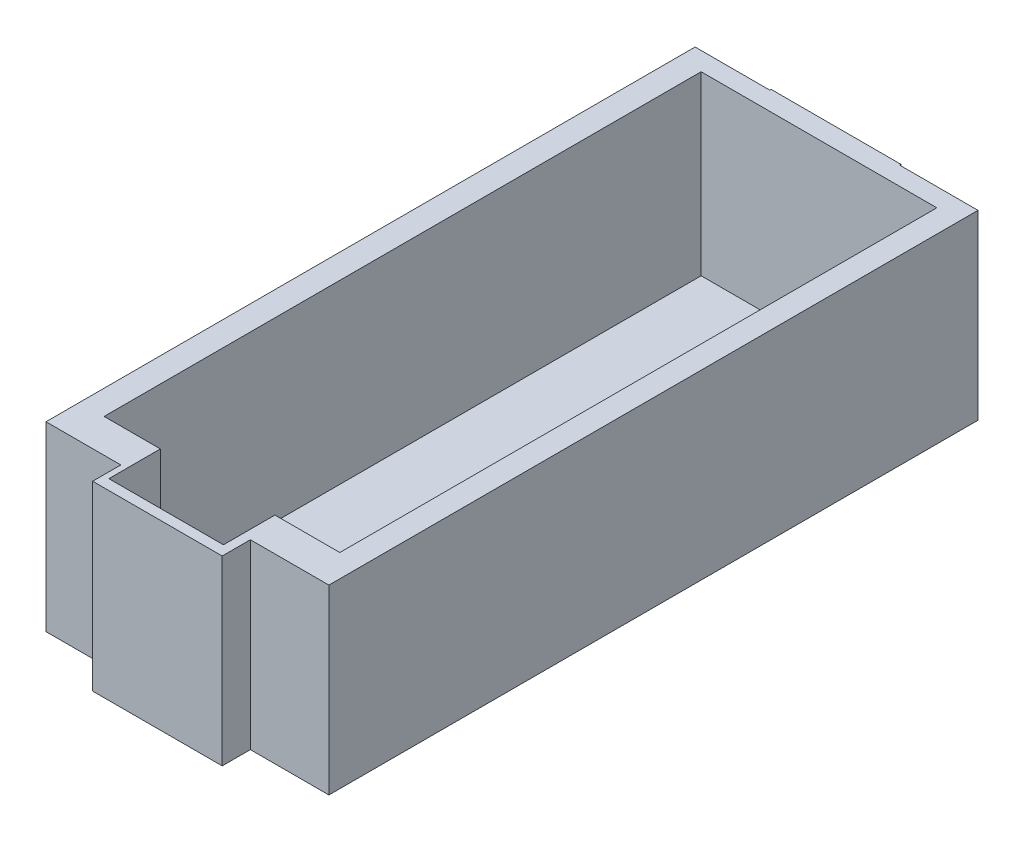
ISO-10303-21;
HEADER;
FILE_DESCRIPTION(('STEP AP214'),'2;1');
FILE_NAME('part.step','',(''),(''),'','','');
FILE_SCHEMA(('AUTOMOTIVE_DESIGN { 1 0 10303 214 1 1 1 1 }'));
ENDSEC;
DATA;
#1=APPLICATION_CONTEXT('core data for automotive mechanical design processes');
#2=APPLICATION_PROTOCOL_DEFINITION('international standard','automotive_design',2000,#1);
#3=PRODUCT_CONTEXT('',#1,'mechanical');
#4=PRODUCT('Part','Part','',(#3));
#5=PRODUCT_RELATED_PRODUCT_CATEGORY('part','',(#4));
#6=PRODUCT_DEFINITION_FORMATION('','',#4);
#7=PRODUCT_DEFINITION_CONTEXT('part definition',#1,'design');
#8=PRODUCT_DEFINITION('design','',#6,#7);
#9=PRODUCT_DEFINITION_SHAPE('','',#8);
#10=(LENGTH_UNIT() NAMED_UNIT(*) SI_UNIT(.MILLI.,.METRE.));
#11=(NAMED_UNIT(*) PLANE_ANGLE_UNIT() SI_UNIT($,.RADIAN.));
#12=(NAMED_UNIT(*) SI_UNIT($,.STERADIAN.) SOLID_ANGLE_UNIT());
#13=UNCERTAINTY_MEASURE_WITH_UNIT(LENGTH_MEASURE(1.E-05),#10,'distance_accuracy_value','');
#14=(GEOMETRIC_REPRESENTATION_CONTEXT(3) GLOBAL_UNCERTAINTY_ASSIGNED_CONTEXT((#13)) GLOBAL_UNIT_ASSIGNED_CONTEXT((#10,
#11,#12)) REPRESENTATION_CONTEXT('',''));
#15=CARTESIAN_POINT('',(0.,0.,0.));
#16=DIRECTION('',(0.,0.,1.));
#17=DIRECTION('',(1.,0.,0.));
#18=AXIS2_PLACEMENT_3D('',#15,#16,#17);
#19=CARTESIAN_POINT('',(-3.05042115850514,12.7577281754318,26.5483315053835));
#20=DIRECTION('',(0.,0.,1.));
#21=DIRECTION('',(1.,0.,0.));
#22=AXIS2_PLACEMENT_3D('',#19,#20,#21);
#23=PLANE('',#22);
#24=DIRECTION('',(1.,0.,0.));
#25=VECTOR('',#24,1.);
#26=CARTESIAN_POINT('',(-3.05042115850514,12.7577281754318,26.5483315053835));
#27=LINE('',#26,#25);
#28=CARTESIAN_POINT('',(4.3035209180502,12.7577281754318,26.5483315053835));
#29=VERTEX_POINT('',#28);
#30=CARTESIAN_POINT('',(7.09590471597179,12.7577281754318,26.5483315053835));
#31=VERTEX_POINT('',#30);
#32=EDGE_CURVE('E234',#29,#31,#27,.T.);
#33=ORIENTED_EDGE('',*,*,#32,.F.);
#34=DIRECTION('',(0.,1.,0.));
#35=VECTOR('',#34,1.);
#36=CARTESIAN_POINT('',(4.3035209180502,12.7577281754318,26.5483315053835));
#37=LINE('',#36,#35);
#38=CARTESIAN_POINT('',(4.3035209180502,20.3640540499087,26.5483315053835));
#39=VERTEX_POINT('',#38);
#40=EDGE_CURVE('E225',#29,#39,#37,.T.);
#41=ORIENTED_EDGE('',*,*,#40,.T.);
#42=DIRECTION('',(1.,0.,0.));
#43=VECTOR('',#42,1.);
#44=CARTESIAN_POINT('',(-3.05042115850514,20.3640540499087,26.5483315053835));
#45=LINE('',#44,#43);
#46=CARTESIAN_POINT('',(7.09590471597179,20.3640540499087,26.5483315053835));
#47=VERTEX_POINT('',#46);
#48=EDGE_CURVE('E249',#39,#47,#45,.T.);
#49=ORIENTED_EDGE('',*,*,#48,.T.);
#50=DIRECTION('',(0.,1.,0.));
#51=VECTOR('',#50,1.);
#52=CARTESIAN_POINT('',(7.09590471597179,12.7577281754318,26.5483315053835));
#53=LINE('',#52,#51);
#54=EDGE_CURVE('E252',#31,#47,#53,.T.);
#55=ORIENTED_EDGE('',*,*,#54,.F.);
#56=EDGE_LOOP('',(#33,#41,#49,#55));
#57=FACE_BOUND('',#56,.T.);
#58=ADVANCED_FACE('F67',(#57),#23,.F.);
#59=CARTESIAN_POINT('',(0.,0.,27.9972287789867));
#60=DIRECTION('',(0.,0.,1.));
#61=DIRECTION('',(1.,0.,0.));
#62=AXIS2_PLACEMENT_3D('',#59,#60,#61);
#63=PLANE('',#62);
#64=DIRECTION('',(-1.,0.,0.));
#65=VECTOR('',#64,1.);
#66=CARTESIAN_POINT('',(-4.10273901714046,12.5386522366116,27.9972287789867));
#67=LINE('',#66,#65);
#68=CARTESIAN_POINT('',(-0.882360232896556,12.5386522366116,27.9972287789867));
#69=VERTEX_POINT('',#68);
#70=CARTESIAN_POINT('',(-4.10273901714046,12.5386522366116,27.9972287789867));
#71=VERTEX_POINT('',#70);
#72=EDGE_CURVE('E307',#69,#71,#67,.T.);
#73=ORIENTED_EDGE('',*,*,#72,.F.);
#74=DIRECTION('',(0.,1.,0.));
#75=VECTOR('',#74,1.);
#76=CARTESIAN_POINT('',(-0.882360232896555,0.,27.9972287789867));
#77=LINE('',#76,#75);
#78=CARTESIAN_POINT('',(-0.882360232896557,20.3640540499087,27.9972287789867));
#79=VERTEX_POINT('',#78);
#80=EDGE_CURVE('E300',#69,#79,#77,.T.);
#81=ORIENTED_EDGE('',*,*,#80,.T.);
#82=DIRECTION('',(1.,0.,0.));
#83=VECTOR('',#82,1.);
#84=CARTESIAN_POINT('',(-4.10273901714046,20.3640540499087,27.9972287789867));
#85=LINE('',#84,#83);
#86=CARTESIAN_POINT('',(-4.10273901714046,20.3640540499087,27.9972287789867));
#87=VERTEX_POINT('',#86);
#88=EDGE_CURVE('E323',#87,#79,#85,.T.);
#89=ORIENTED_EDGE('',*,*,#88,.F.);
#90=DIRECTION('',(0.,1.,0.));
#91=VECTOR('',#90,1.);
#92=CARTESIAN_POINT('',(-4.10273901714046,20.3640540499087,27.9972287789867));
#93=LINE('',#92,#91);
#94=EDGE_CURVE('E303',#71,#87,#93,.T.);
#95=ORIENTED_EDGE('',*,*,#94,.F.);
#96=EDGE_LOOP('',(#73,#81,#89,#95));
#97=FACE_BOUND('',#96,.T.);
#98=ADVANCED_FACE('F69',(#97),#63,.T.);
#99=CARTESIAN_POINT('',(4.69406728467612,20.3640540499087,27.9972287789867));
#100=VERTEX_POINT('',#99);
#101=CARTESIAN_POINT('',(8.07522060652442,20.3640540499087,27.9972287789867));
#102=VERTEX_POINT('',#101);
#103=EDGE_CURVE('E324',#100,#102,#85,.T.);
#104=ORIENTED_EDGE('',*,*,#103,.F.);
#105=DIRECTION('',(0.,-1.,0.));
#106=VECTOR('',#105,1.);
#107=CARTESIAN_POINT('',(4.69406728467613,0.,27.9972287789867));
#108=LINE('',#107,#106);
#109=CARTESIAN_POINT('',(4.69406728467612,12.5386522366116,27.9972287789867));
#110=VERTEX_POINT('',#109);
#111=EDGE_CURVE('E294',#100,#110,#108,.T.);
#112=ORIENTED_EDGE('',*,*,#111,.T.);
#113=CARTESIAN_POINT('',(8.07522060652442,12.5386522366116,27.9972287789867));
#114=VERTEX_POINT('',#113);
#115=EDGE_CURVE('E328',#114,#110,#67,.T.);
#116=ORIENTED_EDGE('',*,*,#115,.F.);
#117=DIRECTION('',(0.,-1.,0.));
#118=VECTOR('',#117,1.);
#119=CARTESIAN_POINT('',(8.07522060652442,20.3640540499087,27.9972287789867));
#120=LINE('',#119,#118);
#121=EDGE_CURVE('E350',#102,#114,#120,.T.);
#122=ORIENTED_EDGE('',*,*,#121,.F.);
#123=EDGE_LOOP('',(#104,#112,#116,#122));
#124=FACE_BOUND('',#123,.T.);
#125=ADVANCED_FACE('F409',(#124),#63,.T.);
#126=CARTESIAN_POINT('',(0.,0.,0.0572287789866853));
#127=DIRECTION('',(0.,0.,1.));
#128=DIRECTION('',(1.,0.,0.));
#129=AXIS2_PLACEMENT_3D('',#126,#127,#128);
#130=PLANE('',#129);
#131=DIRECTION('',(0.,1.,0.));
#132=VECTOR('',#131,1.);
#133=CARTESIAN_POINT('',(-0.882360232896555,0.,0.0572287789866853));
#134=LINE('',#133,#132);
#135=CARTESIAN_POINT('',(-0.882360232896556,12.5386522366116,0.0572287789866846));
#136=VERTEX_POINT('',#135);
#137=CARTESIAN_POINT('',(-0.882360232896557,20.3640540499087,0.0572287789866846));
#138=VERTEX_POINT('',#137);
#139=EDGE_CURVE('E297',#136,#138,#134,.T.);
#140=ORIENTED_EDGE('',*,*,#139,.F.);
#141=DIRECTION('',(-1.,0.,0.));
#142=VECTOR('',#141,1.);
#143=CARTESIAN_POINT('',(-4.10273901714046,12.5386522366116,0.0572287789866846));
#144=LINE('',#143,#142);
#145=CARTESIAN_POINT('',(-4.10273901714046,12.5386522366116,0.0572287789866846));
#146=VERTEX_POINT('',#145);
#147=EDGE_CURVE('E71',#136,#146,#144,.T.);
#148=ORIENTED_EDGE('',*,*,#147,.T.);
#149=DIRECTION('',(0.,1.,0.));
#150=VECTOR('',#149,1.);
#151=CARTESIAN_POINT('',(-4.10273901714046,20.3640540499087,0.0572287789866846));
#152=LINE('',#151,#150);
#153=CARTESIAN_POINT('',(-4.10273901714046,20.3640540499087,0.0572287789866846));
#154=VERTEX_POINT('',#153);
#155=EDGE_CURVE('E308',#146,#154,#152,.T.);
#156=ORIENTED_EDGE('',*,*,#155,.T.);
#157=DIRECTION('',(1.,0.,0.));
#158=VECTOR('',#157,1.);
#159=CARTESIAN_POINT('',(-4.10273901714046,20.3640540499087,0.0572287789866846));
#160=LINE('',#159,#158);
#161=EDGE_CURVE('E12',#154,#138,#160,.T.);
#162=ORIENTED_EDGE('',*,*,#161,.T.);
#163=EDGE_LOOP('',(#140,#148,#156,#162));
#164=FACE_BOUND('',#163,.T.);
#165=ADVANCED_FACE('F368',(#164),#130,.F.);
#166=DIRECTION('',(0.,-1.,0.));
#167=VECTOR('',#166,1.);
#168=CARTESIAN_POINT('',(4.69406728467613,0.,0.0572287789866853));
#169=LINE('',#168,#167);
#170=CARTESIAN_POINT('',(4.69406728467612,20.3640540499087,0.0572287789866906));
#171=VERTEX_POINT('',#170);
#172=CARTESIAN_POINT('',(4.69406728467612,12.5386522366116,0.0572287789866846));
#173=VERTEX_POINT('',#172);
#174=EDGE_CURVE('E291',#171,#173,#169,.T.);
#175=ORIENTED_EDGE('',*,*,#174,.F.);
#176=CARTESIAN_POINT('',(8.07522060652442,20.3640540499087,0.0572287789866846));
#177=VERTEX_POINT('',#176);
#178=EDGE_CURVE('E77',#171,#177,#160,.T.);
#179=ORIENTED_EDGE('',*,*,#178,.T.);
#180=DIRECTION('',(0.,-1.,0.));
#181=VECTOR('',#180,1.);
#182=CARTESIAN_POINT('',(8.07522060652442,20.3640540499087,0.0572287789866846));
#183=LINE('',#182,#181);
#184=CARTESIAN_POINT('',(8.07522060652442,12.5386522366116,0.0572287789866846));
#185=VERTEX_POINT('',#184);
#186=EDGE_CURVE('E402',#177,#185,#183,.T.);
#187=ORIENTED_EDGE('',*,*,#186,.T.);
#188=EDGE_CURVE('E353',#185,#173,#144,.T.);
#189=ORIENTED_EDGE('',*,*,#188,.T.);
#190=EDGE_LOOP('',(#175,#179,#187,#189));
#191=FACE_BOUND('',#190,.T.);
#192=ADVANCED_FACE('F405',(#191),#130,.F.);
#193=CARTESIAN_POINT('',(-4.10273901714046,20.3640540499087,0.0572287789866846));
#194=DIRECTION('',(1.,0.,0.));
#195=DIRECTION('',(0.,0.,-1.));
#196=AXIS2_PLACEMENT_3D('',#193,#194,#195);
#197=PLANE('',#196);
#198=ORIENTED_EDGE('',*,*,#94,.T.);
#199=DIRECTION('',(0.,0.,1.));
#200=VECTOR('',#199,1.);
#201=CARTESIAN_POINT('',(-4.10273901714046,20.3640540499087,0.0572287789866846));
#202=LINE('',#201,#200);
#203=EDGE_CURVE('E304',#154,#87,#202,.T.);
#204=ORIENTED_EDGE('',*,*,#203,.F.);
#205=ORIENTED_EDGE('',*,*,#155,.F.);
#206=DIRECTION('',(0.,0.,1.));
#207=VECTOR('',#206,1.);
#208=CARTESIAN_POINT('',(-4.10273901714046,12.5386522366116,0.0572287789866846));
#209=LINE('',#208,#207);
#210=EDGE_CURVE('E313',#146,#71,#209,.T.);
#211=ORIENTED_EDGE('',*,*,#210,.T.);
#212=EDGE_LOOP('',(#198,#204,#205,#211));
#213=FACE_BOUND('',#212,.T.);
#214=ADVANCED_FACE('F371',(#213),#197,.F.);
#215=CARTESIAN_POINT('',(-4.10273901714046,12.5386522366116,0.0572287789866846));
#216=DIRECTION('',(0.,1.,0.));
#217=DIRECTION('',(0.,0.,1.));
#218=AXIS2_PLACEMENT_3D('',#215,#216,#217);
#219=PLANE('',#218);
#220=ORIENTED_EDGE('',*,*,#115,.T.);
#221=DIRECTION('',(0.,0.,-1.));
#222=VECTOR('',#221,1.);
#223=CARTESIAN_POINT('',(4.69406728467612,12.5386522366116,29.21));
#224=LINE('',#223,#222);
#225=CARTESIAN_POINT('',(4.69406728467612,12.5386522366116,29.21));
#226=VERTEX_POINT('',#225);
#227=EDGE_CURVE('E285',#226,#110,#224,.T.);
#228=ORIENTED_EDGE('',*,*,#227,.F.);
#229=DIRECTION('',(1.,0.,0.));
#230=VECTOR('',#229,1.);
#231=CARTESIAN_POINT('',(-0.882360232896556,12.5386522366116,29.21));
#232=LINE('',#231,#230);
#233=CARTESIAN_POINT('',(-0.882360232896556,12.5386522366116,29.21));
#234=VERTEX_POINT('',#233);
#235=EDGE_CURVE('E261',#234,#226,#232,.T.);
#236=ORIENTED_EDGE('',*,*,#235,.F.);
#237=DIRECTION('',(0.,0.,-1.));
#238=VECTOR('',#237,1.);
#239=CARTESIAN_POINT('',(-0.882360232896556,12.5386522366116,29.21));
#240=LINE('',#239,#238);
#241=EDGE_CURVE('E288',#234,#69,#240,.T.);
#242=ORIENTED_EDGE('',*,*,#241,.T.);
#243=ORIENTED_EDGE('',*,*,#72,.T.);
#244=ORIENTED_EDGE('',*,*,#210,.F.);
#245=ORIENTED_EDGE('',*,*,#147,.F.);
#246=CARTESIAN_POINT('',(-0.882360232896556,12.5386522366116,0.));
#247=VERTEX_POINT('',#246);
#248=EDGE_CURVE('E287',#136,#247,#240,.T.);
#249=ORIENTED_EDGE('',*,*,#248,.T.);
#250=DIRECTION('',(1.,0.,0.));
#251=VECTOR('',#250,1.);
#252=CARTESIAN_POINT('',(-0.882360232896556,12.5386522366116,0.));
#253=LINE('',#252,#251);
#254=CARTESIAN_POINT('',(4.69406728467612,12.5386522366116,0.));
#255=VERTEX_POINT('',#254);
#256=EDGE_CURVE('E271',#247,#255,#253,.T.);
#257=ORIENTED_EDGE('',*,*,#256,.T.);
#258=EDGE_CURVE('E284',#173,#255,#224,.T.);
#259=ORIENTED_EDGE('',*,*,#258,.F.);
#260=ORIENTED_EDGE('',*,*,#188,.F.);
#261=DIRECTION('',(0.,0.,1.));
#262=VECTOR('',#261,1.);
#263=CARTESIAN_POINT('',(8.07522060652442,12.5386522366116,0.0572287789866846));
#264=LINE('',#263,#262);
#265=EDGE_CURVE('E356',#185,#114,#264,.T.);
#266=ORIENTED_EDGE('',*,*,#265,.T.);
#267=EDGE_LOOP('',(#220,#228,#236,#242,#243,#244,#245,#249,#257,#259,#260,#266));
#268=FACE_BOUND('',#267,.T.);
#269=ADVANCED_FACE('F373',(#268),#219,.F.);
#270=CARTESIAN_POINT('',(8.07522060652442,20.3640540499087,0.0572287789866846));
#271=DIRECTION('',(-1.,0.,0.));
#272=DIRECTION('',(0.,0.,1.));
#273=AXIS2_PLACEMENT_3D('',#270,#271,#272);
#274=PLANE('',#273);
#275=ORIENTED_EDGE('',*,*,#121,.T.);
#276=ORIENTED_EDGE('',*,*,#265,.F.);
#277=ORIENTED_EDGE('',*,*,#186,.F.);
#278=DIRECTION('',(0.,0.,1.));
#279=VECTOR('',#278,1.);
#280=CARTESIAN_POINT('',(8.07522060652442,20.3640540499087,0.0572287789866846));
#281=LINE('',#280,#279);
#282=EDGE_CURVE('E318',#177,#102,#281,.T.);
#283=ORIENTED_EDGE('',*,*,#282,.T.);
#284=EDGE_LOOP('',(#275,#276,#277,#283));
#285=FACE_BOUND('',#284,.T.);
#286=ADVANCED_FACE('F400',(#285),#274,.F.);
#287=CARTESIAN_POINT('',(-4.10273901714046,20.3640540499087,0.0572287789866846));
#288=DIRECTION('',(0.,-1.,0.));
#289=DIRECTION('',(0.,0.,-1.));
#290=AXIS2_PLACEMENT_3D('',#287,#288,#289);
#291=PLANE('',#290);
#292=ORIENTED_EDGE('',*,*,#48,.F.);
#293=DIRECTION('',(0.,0.,-1.));
#294=VECTOR('',#293,1.);
#295=CARTESIAN_POINT('',(4.3035209180502,20.3640540499087,28.7652129392163));
#296=LINE('',#295,#294);
#297=CARTESIAN_POINT('',(4.3035209180502,20.3640540499087,28.7652129392163));
#298=VERTEX_POINT('',#297);
#299=EDGE_CURVE('E609',#298,#39,#296,.T.);
#300=ORIENTED_EDGE('',*,*,#299,.F.);
#301=DIRECTION('',(1.,0.,0.));
#302=VECTOR('',#301,1.);
#303=CARTESIAN_POINT('',(-0.628393960971162,20.3640540499087,28.7652129392163));
#304=LINE('',#303,#302);
#305=CARTESIAN_POINT('',(-0.628393960971162,20.3640540499087,28.7652129392163));
#306=VERTEX_POINT('',#305);
#307=EDGE_CURVE('E604',#306,#298,#304,.T.);
#308=ORIENTED_EDGE('',*,*,#307,.F.);
#309=DIRECTION('',(0.,0.,1.));
#310=VECTOR('',#309,1.);
#311=CARTESIAN_POINT('',(-0.628393960971162,20.3640540499087,28.7652129392163));
#312=LINE('',#311,#310);
#313=CARTESIAN_POINT('',(-0.628393960971162,20.3640540499087,26.5483315053835));
#314=VERTEX_POINT('',#313);
#315=EDGE_CURVE('E606',#314,#306,#312,.T.);
#316=ORIENTED_EDGE('',*,*,#315,.F.);
#317=CARTESIAN_POINT('',(-3.05042115850514,20.3640540499087,26.5483315053835));
#318=VERTEX_POINT('',#317);
#319=EDGE_CURVE('E224',#318,#314,#45,.T.);
#320=ORIENTED_EDGE('',*,*,#319,.F.);
#321=DIRECTION('',(0.,0.,1.));
#322=VECTOR('',#321,1.);
#323=CARTESIAN_POINT('',(-3.05042115850514,20.3640540499087,26.5483315053835));
#324=LINE('',#323,#322);
#325=CARTESIAN_POINT('',(-3.05042115850514,20.3640540499087,0.849243341562434));
#326=VERTEX_POINT('',#325);
#327=EDGE_CURVE('E246',#326,#318,#324,.T.);
#328=ORIENTED_EDGE('',*,*,#327,.F.);
#329=DIRECTION('',(-1.,0.,0.));
#330=VECTOR('',#329,1.);
#331=CARTESIAN_POINT('',(-3.05042115850514,20.3640540499087,0.849243341562434));
#332=LINE('',#331,#330);
#333=CARTESIAN_POINT('',(7.09590471597179,20.3640540499087,0.849243341562434));
#334=VERTEX_POINT('',#333);
#335=EDGE_CURVE('E242',#334,#326,#332,.T.);
#336=ORIENTED_EDGE('',*,*,#335,.F.);
#337=DIRECTION('',(0.,0.,-1.));
#338=VECTOR('',#337,1.);
#339=CARTESIAN_POINT('',(7.09590471597179,20.3640540499087,26.5483315053835));
#340=LINE('',#339,#338);
#341=EDGE_CURVE('E93',#47,#334,#340,.T.);
#342=ORIENTED_EDGE('',*,*,#341,.F.);
#343=EDGE_LOOP('',(#292,#300,#308,#316,#320,#328,#336,#342));
#344=FACE_BOUND('',#343,.T.);
#345=ORIENTED_EDGE('',*,*,#178,.F.);
#346=DIRECTION('',(0.,0.,-1.));
#347=VECTOR('',#346,1.);
#348=CARTESIAN_POINT('',(4.69406728467612,20.3640540499087,29.21));
#349=LINE('',#348,#347);
#350=CARTESIAN_POINT('',(4.69406728467612,20.3640540499087,0.));
#351=VERTEX_POINT('',#350);
#352=EDGE_CURVE('E281',#171,#351,#349,.T.);
#353=ORIENTED_EDGE('',*,*,#352,.T.);
#354=DIRECTION('',(-1.,0.,0.));
#355=VECTOR('',#354,1.);
#356=CARTESIAN_POINT('',(-0.882360232896557,20.3640540499087,0.));
#357=LINE('',#356,#355);
#358=CARTESIAN_POINT('',(-0.882360232896557,20.3640540499087,0.));
#359=VERTEX_POINT('',#358);
#360=EDGE_CURVE('E262',#351,#359,#357,.T.);
#361=ORIENTED_EDGE('',*,*,#360,.T.);
#362=DIRECTION('',(0.,0.,-1.));
#363=VECTOR('',#362,1.);
#364=CARTESIAN_POINT('',(-0.882360232896557,20.3640540499087,29.21));
#365=LINE('',#364,#363);
#366=EDGE_CURVE('E268',#138,#359,#365,.T.);
#367=ORIENTED_EDGE('',*,*,#366,.F.);
#368=ORIENTED_EDGE('',*,*,#161,.F.);
#369=ORIENTED_EDGE('',*,*,#203,.T.);
#370=ORIENTED_EDGE('',*,*,#88,.T.);
#371=CARTESIAN_POINT('',(-0.882360232896557,20.3640540499087,29.21));
#372=VERTEX_POINT('',#371);
#373=EDGE_CURVE('E279',#372,#79,#365,.T.);
#374=ORIENTED_EDGE('',*,*,#373,.F.);
#375=DIRECTION('',(-1.,0.,0.));
#376=VECTOR('',#375,1.);
#377=CARTESIAN_POINT('',(-0.882360232896557,20.3640540499087,29.21));
#378=LINE('',#377,#376);
#379=CARTESIAN_POINT('',(4.69406728467612,20.3640540499087,29.21));
#380=VERTEX_POINT('',#379);
#381=EDGE_CURVE('E266',#380,#372,#378,.T.);
#382=ORIENTED_EDGE('',*,*,#381,.F.);
#383=EDGE_CURVE('E282',#380,#100,#349,.T.);
#384=ORIENTED_EDGE('',*,*,#383,.T.);
#385=ORIENTED_EDGE('',*,*,#103,.T.);
#386=ORIENTED_EDGE('',*,*,#282,.F.);
#387=EDGE_LOOP('',(#345,#353,#361,#367,#368,#369,#370,#374,#382,#384,#385,#386));
#388=FACE_BOUND('',#387,.T.);
#389=ADVANCED_FACE('F380',(#344,#388),#291,.F.);
#390=CARTESIAN_POINT('',(0.,0.,0.));
#391=DIRECTION('',(0.,0.,1.));
#392=DIRECTION('',(1.,0.,0.));
#393=AXIS2_PLACEMENT_3D('',#390,#391,#392);
#394=PLANE('',#393);
#395=DIRECTION('',(0.,-1.,0.));
#396=VECTOR('',#395,1.);
#397=CARTESIAN_POINT('',(-0.882360232896557,20.3640540499087,0.));
#398=LINE('',#397,#396);
#399=EDGE_CURVE('E254',#359,#247,#398,.T.);
#400=ORIENTED_EDGE('',*,*,#399,.F.);
#401=ORIENTED_EDGE('',*,*,#360,.F.);
#402=DIRECTION('',(0.,1.,0.));
#403=VECTOR('',#402,1.);
#404=CARTESIAN_POINT('',(4.69406728467612,20.3640540499087,0.));
#405=LINE('',#404,#403);
#406=EDGE_CURVE('E274',#255,#351,#405,.T.);
#407=ORIENTED_EDGE('',*,*,#406,.F.);
#408=ORIENTED_EDGE('',*,*,#256,.F.);
#409=EDGE_LOOP('',(#400,#401,#407,#408));
#410=FACE_BOUND('',#409,.T.);
#411=ADVANCED_FACE('F391',(#410),#394,.F.);
#412=CARTESIAN_POINT('',(4.69406728467612,20.3640540499087,29.21));
#413=DIRECTION('',(-1.,0.,0.));
#414=DIRECTION('',(0.,-1.,0.));
#415=AXIS2_PLACEMENT_3D('',#412,#413,#414);
#416=PLANE('',#415);
#417=ORIENTED_EDGE('',*,*,#352,.F.);
#418=ORIENTED_EDGE('',*,*,#174,.T.);
#419=ORIENTED_EDGE('',*,*,#258,.T.);
#420=ORIENTED_EDGE('',*,*,#406,.T.);
#421=EDGE_LOOP('',(#417,#418,#419,#420));
#422=FACE_BOUND('',#421,.T.);
#423=ADVANCED_FACE('F395',(#422),#416,.F.);
#424=CARTESIAN_POINT('',(-0.882360232896557,20.3640540499087,29.21));
#425=DIRECTION('',(1.,0.,0.));
#426=DIRECTION('',(0.,1.,0.));
#427=AXIS2_PLACEMENT_3D('',#424,#425,#426);
#428=PLANE('',#427);
#429=ORIENTED_EDGE('',*,*,#248,.F.);
#430=ORIENTED_EDGE('',*,*,#139,.T.);
#431=ORIENTED_EDGE('',*,*,#366,.T.);
#432=ORIENTED_EDGE('',*,*,#399,.T.);
#433=EDGE_LOOP('',(#429,#430,#431,#432));
#434=FACE_BOUND('',#433,.T.);
#435=ADVANCED_FACE('F385',(#434),#428,.F.);
#436=ORIENTED_EDGE('',*,*,#80,.F.);
#437=ORIENTED_EDGE('',*,*,#241,.F.);
#438=DIRECTION('',(0.,-1.,0.));
#439=VECTOR('',#438,1.);
#440=CARTESIAN_POINT('',(-0.882360232896557,20.3640540499087,29.21));
#441=LINE('',#440,#439);
#442=EDGE_CURVE('E258',#372,#234,#441,.T.);
#443=ORIENTED_EDGE('',*,*,#442,.F.);
#444=ORIENTED_EDGE('',*,*,#373,.T.);
#445=EDGE_LOOP('',(#436,#437,#443,#444));
#446=FACE_BOUND('',#445,.T.);
#447=ADVANCED_FACE('F419',(#446),#428,.F.);
#448=ORIENTED_EDGE('',*,*,#111,.F.);
#449=ORIENTED_EDGE('',*,*,#383,.F.);
#450=DIRECTION('',(0.,1.,0.));
#451=VECTOR('',#450,1.);
#452=CARTESIAN_POINT('',(4.69406728467612,20.3640540499087,29.21));
#453=LINE('',#452,#451);
#454=EDGE_CURVE('E264',#226,#380,#453,.T.);
#455=ORIENTED_EDGE('',*,*,#454,.F.);
#456=ORIENTED_EDGE('',*,*,#227,.T.);
#457=EDGE_LOOP('',(#448,#449,#455,#456));
#458=FACE_BOUND('',#457,.T.);
#459=ADVANCED_FACE('F415',(#458),#416,.F.);
#460=CARTESIAN_POINT('',(0.,0.,29.21));
#461=DIRECTION('',(0.,0.,1.));
#462=DIRECTION('',(1.,0.,0.));
#463=AXIS2_PLACEMENT_3D('',#460,#461,#462);
#464=PLANE('',#463);
#465=ORIENTED_EDGE('',*,*,#442,.T.);
#466=ORIENTED_EDGE('',*,*,#235,.T.);
#467=ORIENTED_EDGE('',*,*,#454,.T.);
#468=ORIENTED_EDGE('',*,*,#381,.T.);
#469=EDGE_LOOP('',(#465,#466,#467,#468));
#470=FACE_BOUND('',#469,.T.);
#471=ADVANCED_FACE('F417',(#470),#464,.T.);
#472=CARTESIAN_POINT('',(7.09590471597179,12.7577281754318,26.5483315053835));
#473=DIRECTION('',(1.,0.,0.));
#474=DIRECTION('',(0.,0.,-1.));
#475=AXIS2_PLACEMENT_3D('',#472,#473,#474);
#476=PLANE('',#475);
#477=ORIENTED_EDGE('',*,*,#341,.T.);
#478=DIRECTION('',(0.,1.,0.));
#479=VECTOR('',#478,1.);
#480=CARTESIAN_POINT('',(7.09590471597179,12.7577281754318,0.849243341562434));
#481=LINE('',#480,#479);
#482=CARTESIAN_POINT('',(7.09590471597179,12.7577281754318,0.849243341562434));
#483=VERTEX_POINT('',#482);
#484=EDGE_CURVE('E233',#483,#334,#481,.T.);
#485=ORIENTED_EDGE('',*,*,#484,.F.);
#486=DIRECTION('',(0.,0.,-1.));
#487=VECTOR('',#486,1.);
#488=CARTESIAN_POINT('',(7.09590471597179,12.7577281754318,26.5483315053835));
#489=LINE('',#488,#487);
#490=EDGE_CURVE('E251',#31,#483,#489,.T.);
#491=ORIENTED_EDGE('',*,*,#490,.F.);
#492=ORIENTED_EDGE('',*,*,#54,.T.);
#493=EDGE_LOOP('',(#477,#485,#491,#492));
#494=FACE_BOUND('',#493,.T.);
#495=ADVANCED_FACE('F439',(#494),#476,.F.);
#496=ORIENTED_EDGE('',*,*,#319,.T.);
#497=DIRECTION('',(0.,1.,0.));
#498=VECTOR('',#497,1.);
#499=CARTESIAN_POINT('',(-0.628393960971162,12.7577281754318,26.5483315053835));
#500=LINE('',#499,#498);
#501=CARTESIAN_POINT('',(-0.628393960971162,12.7577281754318,26.5483315053835));
#502=VERTEX_POINT('',#501);
#503=EDGE_CURVE('E211',#502,#314,#500,.T.);
#504=ORIENTED_EDGE('',*,*,#503,.F.);
#505=CARTESIAN_POINT('',(-3.05042115850514,12.7577281754318,26.5483315053835));
#506=VERTEX_POINT('',#505);
#507=EDGE_CURVE('E222',#506,#502,#27,.T.);
#508=ORIENTED_EDGE('',*,*,#507,.F.);
#509=DIRECTION('',(0.,1.,0.));
#510=VECTOR('',#509,1.);
#511=CARTESIAN_POINT('',(-3.05042115850514,12.7577281754318,26.5483315053835));
#512=LINE('',#511,#510);
#513=EDGE_CURVE('E255',#506,#318,#512,.T.);
#514=ORIENTED_EDGE('',*,*,#513,.T.);
#515=EDGE_LOOP('',(#496,#504,#508,#514));
#516=FACE_BOUND('',#515,.T.);
#517=ADVANCED_FACE('F221',(#516),#23,.F.);
#518=CARTESIAN_POINT('',(-3.05042115850514,12.7577281754318,26.5483315053835));
#519=DIRECTION('',(-1.,0.,0.));
#520=DIRECTION('',(0.,0.,1.));
#521=AXIS2_PLACEMENT_3D('',#518,#519,#520);
#522=PLANE('',#521);
#523=ORIENTED_EDGE('',*,*,#327,.T.);
#524=ORIENTED_EDGE('',*,*,#513,.F.);
#525=DIRECTION('',(0.,0.,1.));
#526=VECTOR('',#525,1.);
#527=CARTESIAN_POINT('',(-3.05042115850514,12.7577281754318,26.5483315053835));
#528=LINE('',#527,#526);
#529=CARTESIAN_POINT('',(-3.05042115850514,12.7577281754318,0.849243341562434));
#530=VERTEX_POINT('',#529);
#531=EDGE_CURVE('E232',#530,#506,#528,.T.);
#532=ORIENTED_EDGE('',*,*,#531,.F.);
#533=DIRECTION('',(0.,1.,0.));
#534=VECTOR('',#533,1.);
#535=CARTESIAN_POINT('',(-3.05042115850514,12.7577281754318,0.849243341562434));
#536=LINE('',#535,#534);
#537=EDGE_CURVE('E236',#530,#326,#536,.T.);
#538=ORIENTED_EDGE('',*,*,#537,.T.);
#539=EDGE_LOOP('',(#523,#524,#532,#538));
#540=FACE_BOUND('',#539,.T.);
#541=ADVANCED_FACE('F438',(#540),#522,.F.);
#542=CARTESIAN_POINT('',(-3.05042115850514,12.7577281754318,0.849243341562434));
#543=DIRECTION('',(0.,0.,-1.));
#544=DIRECTION('',(-1.,0.,0.));
#545=AXIS2_PLACEMENT_3D('',#542,#543,#544);
#546=PLANE('',#545);
#547=ORIENTED_EDGE('',*,*,#335,.T.);
#548=ORIENTED_EDGE('',*,*,#537,.F.);
#549=DIRECTION('',(-1.,0.,0.));
#550=VECTOR('',#549,1.);
#551=CARTESIAN_POINT('',(-3.05042115850514,12.7577281754318,0.849243341562434));
#552=LINE('',#551,#550);
#553=EDGE_CURVE('E618',#483,#530,#552,.T.);
#554=ORIENTED_EDGE('',*,*,#553,.F.);
#555=ORIENTED_EDGE('',*,*,#484,.T.);
#556=EDGE_LOOP('',(#547,#548,#554,#555));
#557=FACE_BOUND('',#556,.T.);
#558=ADVANCED_FACE('F444',(#557),#546,.F.);
#559=CARTESIAN_POINT('',(0.,12.7577281754318,0.));
#560=DIRECTION('',(0.,-1.,0.));
#561=DIRECTION('',(0.,0.,-1.));
#562=AXIS2_PLACEMENT_3D('',#559,#560,#561);
#563=PLANE('',#562);
#564=ORIENTED_EDGE('',*,*,#490,.T.);
#565=ORIENTED_EDGE('',*,*,#553,.T.);
#566=ORIENTED_EDGE('',*,*,#531,.T.);
#567=ORIENTED_EDGE('',*,*,#507,.T.);
#568=DIRECTION('',(0.,0.,1.));
#569=VECTOR('',#568,1.);
#570=CARTESIAN_POINT('',(-0.628393960971162,12.7577281754318,28.7652129392163));
#571=LINE('',#570,#569);
#572=CARTESIAN_POINT('',(-0.628393960971162,12.7577281754318,28.7652129392163));
#573=VERTEX_POINT('',#572);
#574=EDGE_CURVE('E207',#502,#573,#571,.T.);
#575=ORIENTED_EDGE('',*,*,#574,.T.);
#576=DIRECTION('',(1.,0.,0.));
#577=VECTOR('',#576,1.);
#578=CARTESIAN_POINT('',(-0.628393960971162,12.7577281754318,28.7652129392163));
#579=LINE('',#578,#577);
#580=CARTESIAN_POINT('',(4.3035209180502,12.7577281754318,28.7652129392163));
#581=VERTEX_POINT('',#580);
#582=EDGE_CURVE('E216',#573,#581,#579,.T.);
#583=ORIENTED_EDGE('',*,*,#582,.T.);
#584=DIRECTION('',(0.,0.,-1.));
#585=VECTOR('',#584,1.);
#586=CARTESIAN_POINT('',(4.3035209180502,12.7577281754318,28.7652129392163));
#587=LINE('',#586,#585);
#588=EDGE_CURVE('E85',#581,#29,#587,.T.);
#589=ORIENTED_EDGE('',*,*,#588,.T.);
#590=ORIENTED_EDGE('',*,*,#32,.T.);
#591=EDGE_LOOP('',(#564,#565,#566,#567,#575,#583,#589,#590));
#592=FACE_BOUND('',#591,.T.);
#593=ADVANCED_FACE('F229',(#592),#563,.F.);
#594=CARTESIAN_POINT('',(4.3035209180502,12.7577281754318,28.7652129392163));
#595=DIRECTION('',(1.,0.,0.));
#596=DIRECTION('',(0.,0.,-1.));
#597=AXIS2_PLACEMENT_3D('',#594,#595,#596);
#598=PLANE('',#597);
#599=ORIENTED_EDGE('',*,*,#299,.T.);
#600=ORIENTED_EDGE('',*,*,#40,.F.);
#601=ORIENTED_EDGE('',*,*,#588,.F.);
#602=DIRECTION('',(0.,1.,0.));
#603=VECTOR('',#602,1.);
#604=CARTESIAN_POINT('',(4.3035209180502,12.7577281754318,28.7652129392163));
#605=LINE('',#604,#603);
#606=EDGE_CURVE('E243',#581,#298,#605,.T.);
#607=ORIENTED_EDGE('',*,*,#606,.T.);
#608=EDGE_LOOP('',(#599,#600,#601,#607));
#609=FACE_BOUND('',#608,.T.);
#610=ADVANCED_FACE('F565',(#609),#598,.F.);
#611=CARTESIAN_POINT('',(-0.628393960971162,12.7577281754318,28.7652129392163));
#612=DIRECTION('',(0.,0.,1.));
#613=DIRECTION('',(1.,0.,0.));
#614=AXIS2_PLACEMENT_3D('',#611,#612,#613);
#615=PLANE('',#614);
#616=ORIENTED_EDGE('',*,*,#307,.T.);
#617=ORIENTED_EDGE('',*,*,#606,.F.);
#618=ORIENTED_EDGE('',*,*,#582,.F.);
#619=DIRECTION('',(0.,1.,0.));
#620=VECTOR('',#619,1.);
#621=CARTESIAN_POINT('',(-0.628393960971162,12.7577281754318,28.7652129392163));
#622=LINE('',#621,#620);
#623=EDGE_CURVE('E213',#573,#306,#622,.T.);
#624=ORIENTED_EDGE('',*,*,#623,.T.);
#625=EDGE_LOOP('',(#616,#617,#618,#624));
#626=FACE_BOUND('',#625,.T.);
#627=ADVANCED_FACE('F578',(#626),#615,.F.);
#628=CARTESIAN_POINT('',(-0.628393960971162,12.7577281754318,28.7652129392163));
#629=DIRECTION('',(-1.,0.,0.));
#630=DIRECTION('',(0.,0.,1.));
#631=AXIS2_PLACEMENT_3D('',#628,#629,#630);
#632=PLANE('',#631);
#633=ORIENTED_EDGE('',*,*,#315,.T.);
#634=ORIENTED_EDGE('',*,*,#623,.F.);
#635=ORIENTED_EDGE('',*,*,#574,.F.);
#636=ORIENTED_EDGE('',*,*,#503,.T.);
#637=EDGE_LOOP('',(#633,#634,#635,#636));
#638=FACE_BOUND('',#637,.T.);
#639=ADVANCED_FACE('F210',(#638),#632,.F.);
#640=CLOSED_SHELL('',(#58,#98,#125,#165,#192,#214,#269,#286,#389,#411,#423,#435,#447,#459,#471,
#495,#517,#541,#558,#593,#610,#627,#639));
#641=MANIFOLD_SOLID_BREP('B2',#640);
#642=ADVANCED_BREP_SHAPE_REPRESENTATION('',(#18,#641),#14);
#643=SHAPE_DEFINITION_REPRESENTATION(#9,#642);
ENDSEC;
END-ISO-10303-21;
